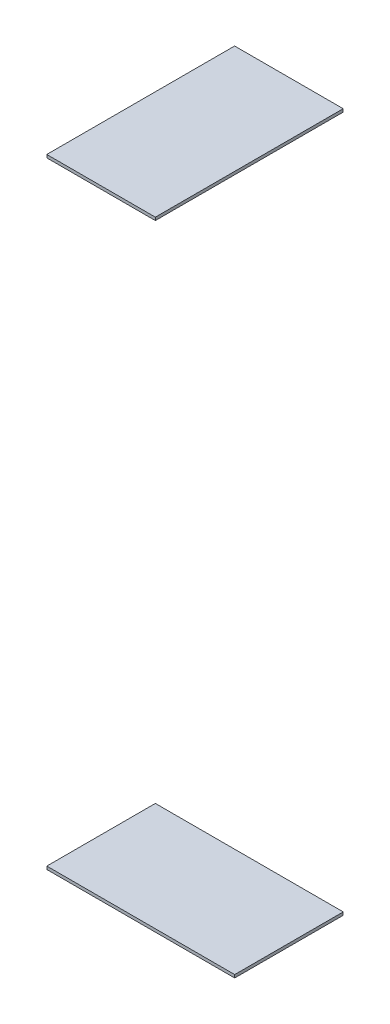
ISO-10303-21;
HEADER;
FILE_DESCRIPTION(('STEP AP214'),'2;1');
FILE_NAME('part.step','',(''),(''),'','','');
FILE_SCHEMA(('AUTOMOTIVE_DESIGN { 1 0 10303 214 1 1 1 1 }'));
ENDSEC;
DATA;
#1=APPLICATION_CONTEXT('core data for automotive mechanical design processes');
#2=APPLICATION_PROTOCOL_DEFINITION('international standard','automotive_design',2000,#1);
#3=PRODUCT_CONTEXT('',#1,'mechanical');
#4=PRODUCT('Part','Part','',(#3));
#5=PRODUCT_RELATED_PRODUCT_CATEGORY('part','',(#4));
#6=PRODUCT_DEFINITION_FORMATION('','',#4);
#7=PRODUCT_DEFINITION_CONTEXT('part definition',#1,'design');
#8=PRODUCT_DEFINITION('design','',#6,#7);
#9=PRODUCT_DEFINITION_SHAPE('','',#8);
#10=(LENGTH_UNIT() NAMED_UNIT(*) SI_UNIT(.MILLI.,.METRE.));
#11=(NAMED_UNIT(*) PLANE_ANGLE_UNIT() SI_UNIT($,.RADIAN.));
#12=(NAMED_UNIT(*) SI_UNIT($,.STERADIAN.) SOLID_ANGLE_UNIT());
#13=UNCERTAINTY_MEASURE_WITH_UNIT(LENGTH_MEASURE(1.E-05),#10,'distance_accuracy_value','');
#14=(GEOMETRIC_REPRESENTATION_CONTEXT(3) GLOBAL_UNCERTAINTY_ASSIGNED_CONTEXT((#13)) GLOBAL_UNIT_ASSIGNED_CONTEXT((#10,
#11,#12)) REPRESENTATION_CONTEXT('',''));
#15=CARTESIAN_POINT('',(0.,0.,0.));
#16=DIRECTION('',(0.,0.,1.));
#17=DIRECTION('',(1.,0.,0.));
#18=AXIS2_PLACEMENT_3D('',#15,#16,#17);
#19=CARTESIAN_POINT('',(-228.647499999999,141.639007656661,-228.647499999999));
#20=DIRECTION('',(0.,0.,1.));
#21=DIRECTION('',(1.,0.,0.));
#22=AXIS2_PLACEMENT_3D('',#19,#20,#21);
#23=PLANE('',#22);
#24=DIRECTION('',(1.,0.,0.));
#25=VECTOR('',#24,1.);
#26=CARTESIAN_POINT('',(-228.647499999999,141.639007656661,-228.647499999999));
#27=LINE('',#26,#25);
#28=CARTESIAN_POINT('',(-186.44895705867,141.639007656661,-228.647499999999));
#29=VERTEX_POINT('',#28);
#30=CARTESIAN_POINT('',(-128.647499999999,141.639007656661,-228.647499999999));
#31=VERTEX_POINT('',#30);
#32=EDGE_CURVE('E12',#29,#31,#27,.T.);
#33=ORIENTED_EDGE('',*,*,#32,.F.);
#34=DIRECTION('',(0.,-1.,0.));
#35=VECTOR('',#34,1.);
#36=CARTESIAN_POINT('',(-186.44895705867,143.226507656661,-228.647499999999));
#37=LINE('',#36,#35);
#38=CARTESIAN_POINT('',(-186.44895705867,143.226507656661,-228.647499999999));
#39=VERTEX_POINT('',#38);
#40=EDGE_CURVE('E83',#39,#29,#37,.T.);
#41=ORIENTED_EDGE('',*,*,#40,.F.);
#42=DIRECTION('',(1.,0.,0.));
#43=VECTOR('',#42,1.);
#44=CARTESIAN_POINT('',(-228.647499999999,143.226507656661,-228.647499999999));
#45=LINE('',#44,#43);
#46=CARTESIAN_POINT('',(-128.647499999999,143.226507656661,-228.647499999999));
#47=VERTEX_POINT('',#46);
#48=EDGE_CURVE('E65',#39,#47,#45,.T.);
#49=ORIENTED_EDGE('',*,*,#48,.T.);
#50=DIRECTION('',(0.,-1.,0.));
#51=VECTOR('',#50,1.);
#52=CARTESIAN_POINT('',(-128.647499999999,141.639007656661,-228.647499999999));
#53=LINE('',#52,#51);
#54=EDGE_CURVE('E90',#47,#31,#53,.T.);
#55=ORIENTED_EDGE('',*,*,#54,.T.);
#56=EDGE_LOOP('',(#33,#41,#49,#55));
#57=FACE_BOUND('',#56,.T.);
#58=ADVANCED_FACE('F43',(#57),#23,.F.);
#59=CARTESIAN_POINT('',(-228.647499999999,141.639007656661,-228.647499999999));
#60=DIRECTION('',(0.,1.,0.));
#61=DIRECTION('',(-1.,0.,0.));
#62=AXIS2_PLACEMENT_3D('',#59,#60,#61);
#63=PLANE('',#62);
#64=DIRECTION('',(1.,0.,0.));
#65=VECTOR('',#64,1.);
#66=CARTESIAN_POINT('',(-228.647499999999,141.639007656661,-128.647499999999));
#67=LINE('',#66,#65);
#68=CARTESIAN_POINT('',(-186.44895705867,141.639007656661,-128.647499999999));
#69=VERTEX_POINT('',#68);
#70=CARTESIAN_POINT('',(-128.647499999999,141.639007656661,-128.647499999999));
#71=VERTEX_POINT('',#70);
#72=EDGE_CURVE('E50',#69,#71,#67,.T.);
#73=ORIENTED_EDGE('',*,*,#72,.F.);
#74=DIRECTION('',(0.,0.,1.));
#75=VECTOR('',#74,1.);
#76=CARTESIAN_POINT('',(-186.44895705867,141.639007656661,-228.647499999999));
#77=LINE('',#76,#75);
#78=EDGE_CURVE('E87',#29,#69,#77,.T.);
#79=ORIENTED_EDGE('',*,*,#78,.F.);
#80=ORIENTED_EDGE('',*,*,#32,.T.);
#81=DIRECTION('',(0.,0.,1.));
#82=VECTOR('',#81,1.);
#83=CARTESIAN_POINT('',(-128.647499999999,141.639007656661,-228.647499999999));
#84=LINE('',#83,#82);
#85=EDGE_CURVE('E110',#31,#71,#84,.T.);
#86=ORIENTED_EDGE('',*,*,#85,.T.);
#87=EDGE_LOOP('',(#73,#79,#80,#86));
#88=FACE_BOUND('',#87,.T.);
#89=ADVANCED_FACE('F111',(#88),#63,.F.);
#90=CARTESIAN_POINT('',(-228.647499999999,141.639007656661,-128.647499999999));
#91=DIRECTION('',(0.,0.,-1.));
#92=DIRECTION('',(-1.,0.,0.));
#93=AXIS2_PLACEMENT_3D('',#90,#91,#92);
#94=PLANE('',#93);
#95=DIRECTION('',(1.,0.,0.));
#96=VECTOR('',#95,1.);
#97=CARTESIAN_POINT('',(-228.647499999999,143.226507656661,-128.647499999999));
#98=LINE('',#97,#96);
#99=CARTESIAN_POINT('',(-186.44895705867,143.226507656661,-128.647499999999));
#100=VERTEX_POINT('',#99);
#101=CARTESIAN_POINT('',(-128.647499999999,143.226507656661,-128.647499999999));
#102=VERTEX_POINT('',#101);
#103=EDGE_CURVE('E96',#100,#102,#98,.T.);
#104=ORIENTED_EDGE('',*,*,#103,.F.);
#105=DIRECTION('',(0.,-1.,0.));
#106=VECTOR('',#105,1.);
#107=CARTESIAN_POINT('',(-186.44895705867,143.226507656661,-128.647499999999));
#108=LINE('',#107,#106);
#109=EDGE_CURVE('E57',#100,#69,#108,.T.);
#110=ORIENTED_EDGE('',*,*,#109,.T.);
#111=ORIENTED_EDGE('',*,*,#72,.T.);
#112=DIRECTION('',(0.,1.,0.));
#113=VECTOR('',#112,1.);
#114=CARTESIAN_POINT('',(-128.647499999999,141.639007656661,-128.647499999999));
#115=LINE('',#114,#113);
#116=EDGE_CURVE('E99',#71,#102,#115,.T.);
#117=ORIENTED_EDGE('',*,*,#116,.T.);
#118=EDGE_LOOP('',(#104,#110,#111,#117));
#119=FACE_BOUND('',#118,.T.);
#120=ADVANCED_FACE('F106',(#119),#94,.F.);
#121=CARTESIAN_POINT('',(-228.647499999999,143.226507656661,-228.647499999999));
#122=DIRECTION('',(0.,-1.,0.));
#123=DIRECTION('',(1.,0.,0.));
#124=AXIS2_PLACEMENT_3D('',#121,#122,#123);
#125=PLANE('',#124);
#126=ORIENTED_EDGE('',*,*,#48,.F.);
#127=DIRECTION('',(0.,0.,1.));
#128=VECTOR('',#127,1.);
#129=CARTESIAN_POINT('',(-186.44895705867,143.226507656661,-228.647499999999));
#130=LINE('',#129,#128);
#131=EDGE_CURVE('E81',#39,#100,#130,.T.);
#132=ORIENTED_EDGE('',*,*,#131,.T.);
#133=ORIENTED_EDGE('',*,*,#103,.T.);
#134=DIRECTION('',(0.,0.,-1.));
#135=VECTOR('',#134,1.);
#136=CARTESIAN_POINT('',(-128.647499999999,143.226507656661,-228.647499999999));
#137=LINE('',#136,#135);
#138=EDGE_CURVE('E94',#102,#47,#137,.T.);
#139=ORIENTED_EDGE('',*,*,#138,.T.);
#140=EDGE_LOOP('',(#126,#132,#133,#139));
#141=FACE_BOUND('',#140,.T.);
#142=ADVANCED_FACE('F92',(#141),#125,.F.);
#143=CARTESIAN_POINT('',(-128.647499999999,0.,0.));
#144=DIRECTION('',(1.,0.,0.));
#145=DIRECTION('',(0.,0.,-1.));
#146=AXIS2_PLACEMENT_3D('',#143,#144,#145);
#147=PLANE('',#146);
#148=ORIENTED_EDGE('',*,*,#54,.F.);
#149=ORIENTED_EDGE('',*,*,#138,.F.);
#150=ORIENTED_EDGE('',*,*,#116,.F.);
#151=ORIENTED_EDGE('',*,*,#85,.F.);
#152=EDGE_LOOP('',(#148,#149,#150,#151));
#153=FACE_BOUND('',#152,.T.);
#154=ADVANCED_FACE('F114',(#153),#147,.T.);
#155=CARTESIAN_POINT('',(-186.44895705867,143.226507656661,-228.647499999999));
#156=DIRECTION('',(1.,0.,0.));
#157=DIRECTION('',(0.,0.,-1.));
#158=AXIS2_PLACEMENT_3D('',#155,#156,#157);
#159=PLANE('',#158);
#160=ORIENTED_EDGE('',*,*,#78,.T.);
#161=ORIENTED_EDGE('',*,*,#109,.F.);
#162=ORIENTED_EDGE('',*,*,#131,.F.);
#163=ORIENTED_EDGE('',*,*,#40,.T.);
#164=EDGE_LOOP('',(#160,#161,#162,#163));
#165=FACE_BOUND('',#164,.T.);
#166=ADVANCED_FACE('F82',(#165),#159,.F.);
#167=CLOSED_SHELL('',(#58,#89,#120,#142,#154,#166));
#168=MANIFOLD_SOLID_BREP('B2',#167);
#169=CARTESIAN_POINT('',(100.022593170594,0.,150.));
#170=DIRECTION('',(-1.,0.,0.));
#171=DIRECTION('',(0.,0.,1.));
#172=AXIS2_PLACEMENT_3D('',#169,#170,#171);
#173=PLANE('',#172);
#174=DIRECTION('',(0.,0.,-1.));
#175=VECTOR('',#174,1.);
#176=CARTESIAN_POINT('',(100.022593170594,1.5875,150.));
#177=LINE('',#176,#175);
#178=CARTESIAN_POINT('',(100.022593170594,1.5875,57.7788638880776));
#179=VERTEX_POINT('',#178);
#180=CARTESIAN_POINT('',(100.022593170594,1.5875,0.));
#181=VERTEX_POINT('',#180);
#182=EDGE_CURVE('E41',#179,#181,#177,.T.);
#183=ORIENTED_EDGE('',*,*,#182,.F.);
#184=DIRECTION('',(0.,-1.,0.));
#185=VECTOR('',#184,1.);
#186=CARTESIAN_POINT('',(100.022593170594,1.5875,57.7788638880776));
#187=LINE('',#186,#185);
#188=CARTESIAN_POINT('',(100.022593170594,0.,57.7788638880776));
#189=VERTEX_POINT('',#188);
#190=EDGE_CURVE('E208',#179,#189,#187,.T.);
#191=ORIENTED_EDGE('',*,*,#190,.T.);
#192=DIRECTION('',(0.,0.,-1.));
#193=VECTOR('',#192,1.);
#194=CARTESIAN_POINT('',(100.022593170594,0.,150.));
#195=LINE('',#194,#193);
#196=CARTESIAN_POINT('',(100.022593170594,0.,0.));
#197=VERTEX_POINT('',#196);
#198=EDGE_CURVE('E189',#189,#197,#195,.T.);
#199=ORIENTED_EDGE('',*,*,#198,.T.);
#200=DIRECTION('',(0.,1.,0.));
#201=VECTOR('',#200,1.);
#202=CARTESIAN_POINT('',(100.022593170594,0.,0.));
#203=LINE('',#202,#201);
#204=EDGE_CURVE('E233',#197,#181,#203,.T.);
#205=ORIENTED_EDGE('',*,*,#204,.T.);
#206=EDGE_LOOP('',(#183,#191,#199,#205));
#207=FACE_BOUND('',#206,.T.);
#208=ADVANCED_FACE('F167',(#207),#173,.F.);
#209=CARTESIAN_POINT('',(100.022593170594,1.5875,150.));
#210=DIRECTION('',(0.,-1.,0.));
#211=DIRECTION('',(0.,0.,-1.));
#212=AXIS2_PLACEMENT_3D('',#209,#210,#211);
#213=PLANE('',#212);
#214=DIRECTION('',(0.,0.,-1.));
#215=VECTOR('',#214,1.);
#216=CARTESIAN_POINT('',(0.,1.5875,150.));
#217=LINE('',#216,#215);
#218=CARTESIAN_POINT('',(0.,1.5875,57.7788638880776));
#219=VERTEX_POINT('',#218);
#220=CARTESIAN_POINT('',(0.,1.5875,0.));
#221=VERTEX_POINT('',#220);
#222=EDGE_CURVE('E174',#219,#221,#217,.T.);
#223=ORIENTED_EDGE('',*,*,#222,.F.);
#224=DIRECTION('',(1.,0.,0.));
#225=VECTOR('',#224,1.);
#226=CARTESIAN_POINT('',(100.022593170594,1.5875,57.7788638880776));
#227=LINE('',#226,#225);
#228=EDGE_CURVE('E206',#219,#179,#227,.T.);
#229=ORIENTED_EDGE('',*,*,#228,.T.);
#230=ORIENTED_EDGE('',*,*,#182,.T.);
#231=DIRECTION('',(-1.,0.,0.));
#232=VECTOR('',#231,1.);
#233=CARTESIAN_POINT('',(100.022593170594,1.5875,0.));
#234=LINE('',#233,#232);
#235=EDGE_CURVE('E223',#181,#221,#234,.T.);
#236=ORIENTED_EDGE('',*,*,#235,.T.);
#237=EDGE_LOOP('',(#223,#229,#230,#236));
#238=FACE_BOUND('',#237,.T.);
#239=ADVANCED_FACE('F221',(#238),#213,.F.);
#240=CARTESIAN_POINT('',(0.,0.,150.));
#241=DIRECTION('',(1.,0.,0.));
#242=DIRECTION('',(0.,0.,-1.));
#243=AXIS2_PLACEMENT_3D('',#240,#241,#242);
#244=PLANE('',#243);
#245=DIRECTION('',(0.,0.,-1.));
#246=VECTOR('',#245,1.);
#247=CARTESIAN_POINT('',(0.,0.,150.));
#248=LINE('',#247,#246);
#249=CARTESIAN_POINT('',(0.,0.,57.7788638880776));
#250=VERTEX_POINT('',#249);
#251=CARTESIAN_POINT('',(0.,0.,0.));
#252=VERTEX_POINT('',#251);
#253=EDGE_CURVE('E219',#250,#252,#248,.T.);
#254=ORIENTED_EDGE('',*,*,#253,.F.);
#255=DIRECTION('',(0.,-1.,0.));
#256=VECTOR('',#255,1.);
#257=CARTESIAN_POINT('',(0.,1.5875,57.7788638880776));
#258=LINE('',#257,#256);
#259=EDGE_CURVE('E181',#219,#250,#258,.T.);
#260=ORIENTED_EDGE('',*,*,#259,.F.);
#261=ORIENTED_EDGE('',*,*,#222,.T.);
#262=DIRECTION('',(0.,-1.,0.));
#263=VECTOR('',#262,1.);
#264=CARTESIAN_POINT('',(0.,0.,0.));
#265=LINE('',#264,#263);
#266=EDGE_CURVE('E230',#221,#252,#265,.T.);
#267=ORIENTED_EDGE('',*,*,#266,.T.);
#268=EDGE_LOOP('',(#254,#260,#261,#267));
#269=FACE_BOUND('',#268,.T.);
#270=ADVANCED_FACE('F216',(#269),#244,.F.);
#271=CARTESIAN_POINT('',(100.022593170594,0.,150.));
#272=DIRECTION('',(0.,1.,0.));
#273=DIRECTION('',(-1.,0.,0.));
#274=AXIS2_PLACEMENT_3D('',#271,#272,#273);
#275=PLANE('',#274);
#276=ORIENTED_EDGE('',*,*,#198,.F.);
#277=DIRECTION('',(1.,0.,0.));
#278=VECTOR('',#277,1.);
#279=CARTESIAN_POINT('',(100.022593170594,0.,57.7788638880776));
#280=LINE('',#279,#278);
#281=EDGE_CURVE('E212',#250,#189,#280,.T.);
#282=ORIENTED_EDGE('',*,*,#281,.F.);
#283=ORIENTED_EDGE('',*,*,#253,.T.);
#284=DIRECTION('',(1.,0.,0.));
#285=VECTOR('',#284,1.);
#286=CARTESIAN_POINT('',(100.022593170594,0.,0.));
#287=LINE('',#286,#285);
#288=EDGE_CURVE('E228',#252,#197,#287,.T.);
#289=ORIENTED_EDGE('',*,*,#288,.T.);
#290=EDGE_LOOP('',(#276,#282,#283,#289));
#291=FACE_BOUND('',#290,.T.);
#292=ADVANCED_FACE('F237',(#291),#275,.F.);
#293=CARTESIAN_POINT('',(0.,0.,0.));
#294=DIRECTION('',(0.,0.,1.));
#295=DIRECTION('',(1.,0.,0.));
#296=AXIS2_PLACEMENT_3D('',#293,#294,#295);
#297=PLANE('',#296);
#298=ORIENTED_EDGE('',*,*,#204,.F.);
#299=ORIENTED_EDGE('',*,*,#288,.F.);
#300=ORIENTED_EDGE('',*,*,#266,.F.);
#301=ORIENTED_EDGE('',*,*,#235,.F.);
#302=EDGE_LOOP('',(#298,#299,#300,#301));
#303=FACE_BOUND('',#302,.T.);
#304=ADVANCED_FACE('F241',(#303),#297,.F.);
#305=CARTESIAN_POINT('',(100.022593170594,1.5875,57.7788638880776));
#306=DIRECTION('',(0.,0.,-1.));
#307=DIRECTION('',(-1.,0.,0.));
#308=AXIS2_PLACEMENT_3D('',#305,#306,#307);
#309=PLANE('',#308);
#310=ORIENTED_EDGE('',*,*,#281,.T.);
#311=ORIENTED_EDGE('',*,*,#190,.F.);
#312=ORIENTED_EDGE('',*,*,#228,.F.);
#313=ORIENTED_EDGE('',*,*,#259,.T.);
#314=EDGE_LOOP('',(#310,#311,#312,#313));
#315=FACE_BOUND('',#314,.T.);
#316=ADVANCED_FACE('F207',(#315),#309,.F.);
#317=CLOSED_SHELL('',(#208,#239,#270,#292,#304,#316));
#318=MANIFOLD_SOLID_BREP('B6',#317);
#319=ADVANCED_BREP_SHAPE_REPRESENTATION('',(#18,#168,#318),#14);
#320=SHAPE_DEFINITION_REPRESENTATION(#9,#319);
ENDSEC;
END-ISO-10303-21;
